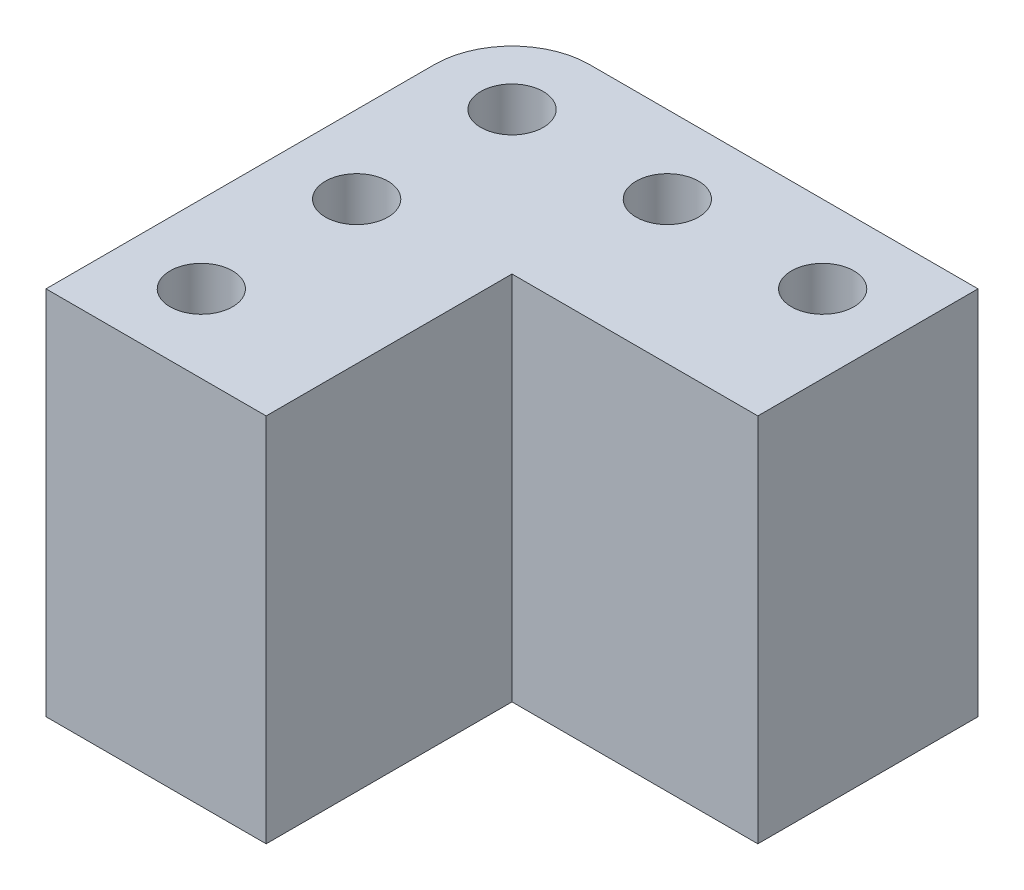
ISO-10303-21;
HEADER;
FILE_DESCRIPTION(('STEP AP214'),'2;1');
FILE_NAME('part.step','',(''),(''),'','','');
FILE_SCHEMA(('AUTOMOTIVE_DESIGN { 1 0 10303 214 1 1 1 1 }'));
ENDSEC;
DATA;
#1=APPLICATION_CONTEXT('core data for automotive mechanical design processes');
#2=APPLICATION_PROTOCOL_DEFINITION('international standard','automotive_design',2000,#1);
#3=PRODUCT_CONTEXT('',#1,'mechanical');
#4=PRODUCT('Part','Part','',(#3));
#5=PRODUCT_RELATED_PRODUCT_CATEGORY('part','',(#4));
#6=PRODUCT_DEFINITION_FORMATION('','',#4);
#7=PRODUCT_DEFINITION_CONTEXT('part definition',#1,'design');
#8=PRODUCT_DEFINITION('design','',#6,#7);
#9=PRODUCT_DEFINITION_SHAPE('','',#8);
#10=(LENGTH_UNIT() NAMED_UNIT(*) SI_UNIT(.MILLI.,.METRE.));
#11=(NAMED_UNIT(*) PLANE_ANGLE_UNIT() SI_UNIT($,.RADIAN.));
#12=(NAMED_UNIT(*) SI_UNIT($,.STERADIAN.) SOLID_ANGLE_UNIT());
#13=UNCERTAINTY_MEASURE_WITH_UNIT(LENGTH_MEASURE(1.E-05),#10,'distance_accuracy_value','');
#14=(GEOMETRIC_REPRESENTATION_CONTEXT(3) GLOBAL_UNCERTAINTY_ASSIGNED_CONTEXT((#13)) GLOBAL_UNIT_ASSIGNED_CONTEXT((#10,
#11,#12)) REPRESENTATION_CONTEXT('',''));
#15=CARTESIAN_POINT('',(0.,0.,0.));
#16=DIRECTION('',(0.,0.,1.));
#17=DIRECTION('',(1.,0.,0.));
#18=AXIS2_PLACEMENT_3D('',#15,#16,#17);
#19=CARTESIAN_POINT('',(0.,30.3,0.));
#20=DIRECTION('',(0.,1.,0.));
#21=DIRECTION('',(0.,0.,1.));
#22=AXIS2_PLACEMENT_3D('',#19,#20,#21);
#23=PLANE('',#22);
#24=CARTESIAN_POINT('',(6.35000000000002,30.3,6.35000000000001));
#25=DIRECTION('',(0.,1.,0.));
#26=DIRECTION('',(0.,0.,1.));
#27=AXIS2_PLACEMENT_3D('',#24,#25,#26);
#28=CIRCLE('',#27,2.55270000000002);
#29=CARTESIAN_POINT('',(6.35000000000002,30.3,8.90270000000003));
#30=VERTEX_POINT('',#29);
#31=EDGE_CURVE('E175',#30,#30,#28,.T.);
#32=ORIENTED_EDGE('',*,*,#31,.F.);
#33=EDGE_LOOP('',(#32));
#34=FACE_BOUND('',#33,.T.);
#35=CARTESIAN_POINT('',(19.05,30.3,6.35000000000001));
#36=DIRECTION('',(0.,1.,0.));
#37=DIRECTION('',(0.,0.,1.));
#38=AXIS2_PLACEMENT_3D('',#35,#36,#37);
#39=CIRCLE('',#38,2.55269999999999);
#40=CARTESIAN_POINT('',(19.05,30.3,8.9027));
#41=VERTEX_POINT('',#40);
#42=EDGE_CURVE('E172',#41,#41,#39,.T.);
#43=ORIENTED_EDGE('',*,*,#42,.F.);
#44=EDGE_LOOP('',(#43));
#45=FACE_BOUND('',#44,.T.);
#46=CARTESIAN_POINT('',(31.75,30.3,6.35000000000001));
#47=DIRECTION('',(0.,1.,0.));
#48=DIRECTION('',(0.,0.,1.));
#49=AXIS2_PLACEMENT_3D('',#46,#47,#48);
#50=CIRCLE('',#49,2.55269999999999);
#51=CARTESIAN_POINT('',(31.75,30.3,8.9027));
#52=VERTEX_POINT('',#51);
#53=EDGE_CURVE('E179',#52,#52,#50,.T.);
#54=ORIENTED_EDGE('',*,*,#53,.F.);
#55=EDGE_LOOP('',(#54));
#56=FACE_BOUND('',#55,.T.);
#57=CARTESIAN_POINT('',(6.35000000000002,30.3,19.05));
#58=DIRECTION('',(0.,1.,0.));
#59=DIRECTION('',(0.,0.,1.));
#60=AXIS2_PLACEMENT_3D('',#57,#58,#59);
#61=CIRCLE('',#60,2.55270000000002);
#62=CARTESIAN_POINT('',(6.35000000000002,30.3,21.6027));
#63=VERTEX_POINT('',#62);
#64=EDGE_CURVE('E185',#63,#63,#61,.T.);
#65=ORIENTED_EDGE('',*,*,#64,.F.);
#66=EDGE_LOOP('',(#65));
#67=FACE_BOUND('',#66,.T.);
#68=CARTESIAN_POINT('',(6.35000000000002,30.3,31.75));
#69=DIRECTION('',(0.,1.,0.));
#70=DIRECTION('',(0.,0.,1.));
#71=AXIS2_PLACEMENT_3D('',#68,#69,#70);
#72=CIRCLE('',#71,2.55270000000002);
#73=CARTESIAN_POINT('',(6.35000000000002,30.3,34.3027));
#74=VERTEX_POINT('',#73);
#75=EDGE_CURVE('E167',#74,#74,#72,.T.);
#76=ORIENTED_EDGE('',*,*,#75,.F.);
#77=EDGE_LOOP('',(#76));
#78=FACE_BOUND('',#77,.T.);
#79=CARTESIAN_POINT('',(6.35000000000002,30.3,6.35000000000002));
#80=DIRECTION('',(0.,-1.,0.));
#81=DIRECTION('',(0.,0.,1.));
#82=AXIS2_PLACEMENT_3D('',#79,#80,#81);
#83=CIRCLE('',#82,6.35000000000002);
#84=CARTESIAN_POINT('',(0.,30.3,6.35000000000001));
#85=VERTEX_POINT('',#84);
#86=CARTESIAN_POINT('',(6.35000000000002,30.3,0.));
#87=VERTEX_POINT('',#86);
#88=EDGE_CURVE('E154',#85,#87,#83,.T.);
#89=ORIENTED_EDGE('',*,*,#88,.F.);
#90=DIRECTION('',(0.,0.,1.));
#91=VECTOR('',#90,1.);
#92=CARTESIAN_POINT('',(0.,30.3,0.));
#93=LINE('',#92,#91);
#94=CARTESIAN_POINT('',(0.,30.3,38.1));
#95=VERTEX_POINT('',#94);
#96=EDGE_CURVE('E95',#85,#95,#93,.T.);
#97=ORIENTED_EDGE('',*,*,#96,.T.);
#98=DIRECTION('',(1.,0.,0.));
#99=VECTOR('',#98,1.);
#100=CARTESIAN_POINT('',(0.,30.3,38.1));
#101=LINE('',#100,#99);
#102=CARTESIAN_POINT('',(18.,30.3,38.1));
#103=VERTEX_POINT('',#102);
#104=EDGE_CURVE('E108',#95,#103,#101,.T.);
#105=ORIENTED_EDGE('',*,*,#104,.T.);
#106=DIRECTION('',(0.,0.,-1.));
#107=VECTOR('',#106,1.);
#108=CARTESIAN_POINT('',(18.,30.3,38.1));
#109=LINE('',#108,#107);
#110=CARTESIAN_POINT('',(18.,30.3,18.));
#111=VERTEX_POINT('',#110);
#112=EDGE_CURVE('E103',#103,#111,#109,.T.);
#113=ORIENTED_EDGE('',*,*,#112,.T.);
#114=DIRECTION('',(1.,0.,0.));
#115=VECTOR('',#114,1.);
#116=CARTESIAN_POINT('',(18.,30.3,18.));
#117=LINE('',#116,#115);
#118=CARTESIAN_POINT('',(38.1,30.3,18.));
#119=VERTEX_POINT('',#118);
#120=EDGE_CURVE('E106',#111,#119,#117,.T.);
#121=ORIENTED_EDGE('',*,*,#120,.T.);
#122=DIRECTION('',(0.,0.,-1.));
#123=VECTOR('',#122,1.);
#124=CARTESIAN_POINT('',(38.1,30.3,18.));
#125=LINE('',#124,#123);
#126=CARTESIAN_POINT('',(38.1,30.3,0.));
#127=VERTEX_POINT('',#126);
#128=EDGE_CURVE('E63',#119,#127,#125,.T.);
#129=ORIENTED_EDGE('',*,*,#128,.T.);
#130=DIRECTION('',(-1.,0.,0.));
#131=VECTOR('',#130,1.);
#132=CARTESIAN_POINT('',(0.,30.3,0.));
#133=LINE('',#132,#131);
#134=EDGE_CURVE('E124',#127,#87,#133,.T.);
#135=ORIENTED_EDGE('',*,*,#134,.T.);
#136=EDGE_LOOP('',(#89,#97,#105,#113,#121,#129,#135));
#137=FACE_BOUND('',#136,.T.);
#138=ADVANCED_FACE('F39',(#34,#45,#56,#67,#78,#137),#23,.T.);
#139=CARTESIAN_POINT('',(0.,0.,0.));
#140=DIRECTION('',(0.,1.,0.));
#141=DIRECTION('',(0.,0.,1.));
#142=AXIS2_PLACEMENT_3D('',#139,#140,#141);
#143=PLANE('',#142);
#144=CARTESIAN_POINT('',(6.35000000000002,0.,31.75));
#145=DIRECTION('',(0.,1.,0.));
#146=DIRECTION('',(0.,0.,1.));
#147=AXIS2_PLACEMENT_3D('',#144,#145,#146);
#148=CIRCLE('',#147,2.55270000000002);
#149=CARTESIAN_POINT('',(6.35000000000002,0.,34.3027));
#150=VERTEX_POINT('',#149);
#151=EDGE_CURVE('E164',#150,#150,#148,.T.);
#152=ORIENTED_EDGE('',*,*,#151,.T.);
#153=EDGE_LOOP('',(#152));
#154=FACE_BOUND('',#153,.T.);
#155=CARTESIAN_POINT('',(6.35000000000002,0.,19.05));
#156=DIRECTION('',(0.,1.,0.));
#157=DIRECTION('',(0.,0.,1.));
#158=AXIS2_PLACEMENT_3D('',#155,#156,#157);
#159=CIRCLE('',#158,2.55270000000002);
#160=CARTESIAN_POINT('',(6.35000000000002,0.,21.6027));
#161=VERTEX_POINT('',#160);
#162=EDGE_CURVE('E188',#161,#161,#159,.T.);
#163=ORIENTED_EDGE('',*,*,#162,.T.);
#164=EDGE_LOOP('',(#163));
#165=FACE_BOUND('',#164,.T.);
#166=CARTESIAN_POINT('',(31.75,0.,6.35000000000001));
#167=DIRECTION('',(0.,1.,0.));
#168=DIRECTION('',(0.,0.,1.));
#169=AXIS2_PLACEMENT_3D('',#166,#167,#168);
#170=CIRCLE('',#169,2.55269999999999);
#171=CARTESIAN_POINT('',(31.75,0.,8.9027));
#172=VERTEX_POINT('',#171);
#173=EDGE_CURVE('E182',#172,#172,#170,.T.);
#174=ORIENTED_EDGE('',*,*,#173,.T.);
#175=EDGE_LOOP('',(#174));
#176=FACE_BOUND('',#175,.T.);
#177=CARTESIAN_POINT('',(19.05,0.,6.35000000000001));
#178=DIRECTION('',(0.,1.,0.));
#179=DIRECTION('',(0.,0.,1.));
#180=AXIS2_PLACEMENT_3D('',#177,#178,#179);
#181=CIRCLE('',#180,2.55269999999999);
#182=CARTESIAN_POINT('',(19.05,0.,8.9027));
#183=VERTEX_POINT('',#182);
#184=EDGE_CURVE('E176',#183,#183,#181,.T.);
#185=ORIENTED_EDGE('',*,*,#184,.T.);
#186=EDGE_LOOP('',(#185));
#187=FACE_BOUND('',#186,.T.);
#188=CARTESIAN_POINT('',(6.35000000000002,0.,6.35000000000001));
#189=DIRECTION('',(0.,1.,0.));
#190=DIRECTION('',(0.,0.,1.));
#191=AXIS2_PLACEMENT_3D('',#188,#189,#190);
#192=CIRCLE('',#191,2.55270000000002);
#193=CARTESIAN_POINT('',(6.35000000000002,0.,8.90270000000003));
#194=VERTEX_POINT('',#193);
#195=EDGE_CURVE('E133',#194,#194,#192,.T.);
#196=ORIENTED_EDGE('',*,*,#195,.T.);
#197=EDGE_LOOP('',(#196));
#198=FACE_BOUND('',#197,.T.);
#199=DIRECTION('',(0.,0.,1.));
#200=VECTOR('',#199,1.);
#201=CARTESIAN_POINT('',(0.,0.,0.));
#202=LINE('',#201,#200);
#203=CARTESIAN_POINT('',(0.,0.,6.35000000000001));
#204=VERTEX_POINT('',#203);
#205=CARTESIAN_POINT('',(0.,0.,38.1));
#206=VERTEX_POINT('',#205);
#207=EDGE_CURVE('E130',#204,#206,#202,.T.);
#208=ORIENTED_EDGE('',*,*,#207,.F.);
#209=CARTESIAN_POINT('',(6.35000000000002,0.,6.35000000000002));
#210=DIRECTION('',(0.,-1.,0.));
#211=DIRECTION('',(0.,0.,1.));
#212=AXIS2_PLACEMENT_3D('',#209,#210,#211);
#213=CIRCLE('',#212,6.35000000000002);
#214=CARTESIAN_POINT('',(6.35000000000002,0.,0.));
#215=VERTEX_POINT('',#214);
#216=EDGE_CURVE('E157',#204,#215,#213,.T.);
#217=ORIENTED_EDGE('',*,*,#216,.T.);
#218=DIRECTION('',(-1.,0.,0.));
#219=VECTOR('',#218,1.);
#220=CARTESIAN_POINT('',(0.,0.,0.));
#221=LINE('',#220,#219);
#222=CARTESIAN_POINT('',(38.1,0.,0.));
#223=VERTEX_POINT('',#222);
#224=EDGE_CURVE('E139',#223,#215,#221,.T.);
#225=ORIENTED_EDGE('',*,*,#224,.F.);
#226=DIRECTION('',(0.,0.,-1.));
#227=VECTOR('',#226,1.);
#228=CARTESIAN_POINT('',(38.1,0.,18.));
#229=LINE('',#228,#227);
#230=CARTESIAN_POINT('',(38.1,0.,18.));
#231=VERTEX_POINT('',#230);
#232=EDGE_CURVE('E87',#231,#223,#229,.T.);
#233=ORIENTED_EDGE('',*,*,#232,.F.);
#234=DIRECTION('',(1.,0.,0.));
#235=VECTOR('',#234,1.);
#236=CARTESIAN_POINT('',(18.,0.,18.));
#237=LINE('',#236,#235);
#238=CARTESIAN_POINT('',(18.,0.,18.));
#239=VERTEX_POINT('',#238);
#240=EDGE_CURVE('E136',#239,#231,#237,.T.);
#241=ORIENTED_EDGE('',*,*,#240,.F.);
#242=DIRECTION('',(0.,0.,-1.));
#243=VECTOR('',#242,1.);
#244=CARTESIAN_POINT('',(18.,0.,38.1));
#245=LINE('',#244,#243);
#246=CARTESIAN_POINT('',(18.,0.,38.1));
#247=VERTEX_POINT('',#246);
#248=EDGE_CURVE('E117',#247,#239,#245,.T.);
#249=ORIENTED_EDGE('',*,*,#248,.F.);
#250=DIRECTION('',(1.,0.,0.));
#251=VECTOR('',#250,1.);
#252=CARTESIAN_POINT('',(0.,0.,38.1));
#253=LINE('',#252,#251);
#254=EDGE_CURVE('E132',#206,#247,#253,.T.);
#255=ORIENTED_EDGE('',*,*,#254,.F.);
#256=EDGE_LOOP('',(#208,#217,#225,#233,#241,#249,#255));
#257=FACE_BOUND('',#256,.T.);
#258=ADVANCED_FACE('F147',(#154,#165,#176,#187,#198,#257),#143,.F.);
#259=CARTESIAN_POINT('',(0.,30.3,0.));
#260=DIRECTION('',(1.,0.,0.));
#261=DIRECTION('',(0.,0.,-1.));
#262=AXIS2_PLACEMENT_3D('',#259,#260,#261);
#263=PLANE('',#262);
#264=ORIENTED_EDGE('',*,*,#96,.F.);
#265=DIRECTION('',(0.,1.,0.));
#266=VECTOR('',#265,1.);
#267=CARTESIAN_POINT('',(0.,0.,6.35000000000001));
#268=LINE('',#267,#266);
#269=EDGE_CURVE('E160',#204,#85,#268,.T.);
#270=ORIENTED_EDGE('',*,*,#269,.F.);
#271=ORIENTED_EDGE('',*,*,#207,.T.);
#272=DIRECTION('',(0.,-1.,0.));
#273=VECTOR('',#272,1.);
#274=CARTESIAN_POINT('',(0.,30.3,38.1));
#275=LINE('',#274,#273);
#276=EDGE_CURVE('E11',#95,#206,#275,.T.);
#277=ORIENTED_EDGE('',*,*,#276,.F.);
#278=EDGE_LOOP('',(#264,#270,#271,#277));
#279=FACE_BOUND('',#278,.T.);
#280=ADVANCED_FACE('F41',(#279),#263,.F.);
#281=CARTESIAN_POINT('',(0.,30.3,38.1));
#282=DIRECTION('',(0.,0.,-1.));
#283=DIRECTION('',(-1.,0.,0.));
#284=AXIS2_PLACEMENT_3D('',#281,#282,#283);
#285=PLANE('',#284);
#286=ORIENTED_EDGE('',*,*,#254,.T.);
#287=DIRECTION('',(0.,-1.,0.));
#288=VECTOR('',#287,1.);
#289=CARTESIAN_POINT('',(18.,30.3,38.1));
#290=LINE('',#289,#288);
#291=EDGE_CURVE('E47',#103,#247,#290,.T.);
#292=ORIENTED_EDGE('',*,*,#291,.F.);
#293=ORIENTED_EDGE('',*,*,#104,.F.);
#294=ORIENTED_EDGE('',*,*,#276,.T.);
#295=EDGE_LOOP('',(#286,#292,#293,#294));
#296=FACE_BOUND('',#295,.T.);
#297=ADVANCED_FACE('F242',(#296),#285,.F.);
#298=CARTESIAN_POINT('',(18.,30.3,38.1));
#299=DIRECTION('',(-1.,0.,0.));
#300=DIRECTION('',(0.,0.,1.));
#301=AXIS2_PLACEMENT_3D('',#298,#299,#300);
#302=PLANE('',#301);
#303=ORIENTED_EDGE('',*,*,#248,.T.);
#304=DIRECTION('',(0.,-1.,0.));
#305=VECTOR('',#304,1.);
#306=CARTESIAN_POINT('',(18.,30.3,18.));
#307=LINE('',#306,#305);
#308=EDGE_CURVE('E114',#111,#239,#307,.T.);
#309=ORIENTED_EDGE('',*,*,#308,.F.);
#310=ORIENTED_EDGE('',*,*,#112,.F.);
#311=ORIENTED_EDGE('',*,*,#291,.T.);
#312=EDGE_LOOP('',(#303,#309,#310,#311));
#313=FACE_BOUND('',#312,.T.);
#314=ADVANCED_FACE('F115',(#313),#302,.F.);
#315=CARTESIAN_POINT('',(18.,30.3,18.));
#316=DIRECTION('',(0.,0.,-1.));
#317=DIRECTION('',(-1.,0.,0.));
#318=AXIS2_PLACEMENT_3D('',#315,#316,#317);
#319=PLANE('',#318);
#320=ORIENTED_EDGE('',*,*,#240,.T.);
#321=DIRECTION('',(0.,-1.,0.));
#322=VECTOR('',#321,1.);
#323=CARTESIAN_POINT('',(38.1,30.3,18.));
#324=LINE('',#323,#322);
#325=EDGE_CURVE('E120',#119,#231,#324,.T.);
#326=ORIENTED_EDGE('',*,*,#325,.F.);
#327=ORIENTED_EDGE('',*,*,#120,.F.);
#328=ORIENTED_EDGE('',*,*,#308,.T.);
#329=EDGE_LOOP('',(#320,#326,#327,#328));
#330=FACE_BOUND('',#329,.T.);
#331=ADVANCED_FACE('F122',(#330),#319,.F.);
#332=CARTESIAN_POINT('',(38.1,30.3,18.));
#333=DIRECTION('',(-1.,0.,0.));
#334=DIRECTION('',(0.,0.,1.));
#335=AXIS2_PLACEMENT_3D('',#332,#333,#334);
#336=PLANE('',#335);
#337=ORIENTED_EDGE('',*,*,#232,.T.);
#338=DIRECTION('',(0.,-1.,0.));
#339=VECTOR('',#338,1.);
#340=CARTESIAN_POINT('',(38.1,30.3,0.));
#341=LINE('',#340,#339);
#342=EDGE_CURVE('E129',#127,#223,#341,.T.);
#343=ORIENTED_EDGE('',*,*,#342,.F.);
#344=ORIENTED_EDGE('',*,*,#128,.F.);
#345=ORIENTED_EDGE('',*,*,#325,.T.);
#346=EDGE_LOOP('',(#337,#343,#344,#345));
#347=FACE_BOUND('',#346,.T.);
#348=ADVANCED_FACE('F149',(#347),#336,.F.);
#349=CARTESIAN_POINT('',(0.,30.3,0.));
#350=DIRECTION('',(0.,0.,1.));
#351=DIRECTION('',(1.,0.,0.));
#352=AXIS2_PLACEMENT_3D('',#349,#350,#351);
#353=PLANE('',#352);
#354=ORIENTED_EDGE('',*,*,#224,.T.);
#355=DIRECTION('',(0.,1.,0.));
#356=VECTOR('',#355,1.);
#357=CARTESIAN_POINT('',(6.35000000000002,0.,0.));
#358=LINE('',#357,#356);
#359=EDGE_CURVE('E54',#215,#87,#358,.T.);
#360=ORIENTED_EDGE('',*,*,#359,.T.);
#361=ORIENTED_EDGE('',*,*,#134,.F.);
#362=ORIENTED_EDGE('',*,*,#342,.T.);
#363=EDGE_LOOP('',(#354,#360,#361,#362));
#364=FACE_BOUND('',#363,.T.);
#365=ADVANCED_FACE('F152',(#364),#353,.F.);
#366=CARTESIAN_POINT('',(6.35000000000002,0.,6.35000000000001));
#367=DIRECTION('',(0.,1.,0.));
#368=DIRECTION('',(0.,0.,1.));
#369=AXIS2_PLACEMENT_3D('',#366,#367,#368);
#370=CYLINDRICAL_SURFACE('',#369,2.55270000000002);
#371=CARTESIAN_POINT('',(6.35000000000002,0.,8.90270000000003));
#372=CARTESIAN_POINT('',(6.35000000000002,0.315625,8.90270000000003));
#373=CARTESIAN_POINT('',(6.35000000000002,0.63125,8.90270000000003));
#374=CARTESIAN_POINT('',(6.35000000000002,1.2625,8.90270000000003));
#375=CARTESIAN_POINT('',(6.35000000000002,1.578125,8.90270000000003));
#376=CARTESIAN_POINT('',(6.35000000000002,2.209375,8.90270000000003));
#377=CARTESIAN_POINT('',(6.35000000000002,2.525,8.90270000000003));
#378=CARTESIAN_POINT('',(6.35000000000002,3.15625,8.90270000000003));
#379=CARTESIAN_POINT('',(6.35000000000002,3.471875,8.90270000000003));
#380=CARTESIAN_POINT('',(6.35000000000002,4.103125,8.90270000000003));
#381=CARTESIAN_POINT('',(6.35000000000002,4.41875,8.90270000000003));
#382=CARTESIAN_POINT('',(6.35000000000002,5.05,8.90270000000003));
#383=CARTESIAN_POINT('',(6.35000000000002,5.365625,8.90270000000003));
#384=CARTESIAN_POINT('',(6.35000000000002,5.996875,8.90270000000003));
#385=CARTESIAN_POINT('',(6.35000000000002,6.3125,8.90270000000003));
#386=CARTESIAN_POINT('',(6.35000000000002,6.94375,8.90270000000003));
#387=CARTESIAN_POINT('',(6.35000000000002,7.259375,8.90270000000003));
#388=CARTESIAN_POINT('',(6.35000000000002,7.890625,8.90270000000003));
#389=CARTESIAN_POINT('',(6.35000000000002,8.20625,8.90270000000003));
#390=CARTESIAN_POINT('',(6.35000000000002,8.8375,8.90270000000003));
#391=CARTESIAN_POINT('',(6.35000000000002,9.153125,8.90270000000003));
#392=CARTESIAN_POINT('',(6.35000000000002,9.784375,8.90270000000003));
#393=CARTESIAN_POINT('',(6.35000000000002,10.1,8.90270000000003));
#394=CARTESIAN_POINT('',(6.35000000000002,10.73125,8.90270000000003));
#395=CARTESIAN_POINT('',(6.35000000000002,11.046875,8.90270000000003));
#396=CARTESIAN_POINT('',(6.35000000000002,11.678125,8.90270000000003));
#397=CARTESIAN_POINT('',(6.35000000000002,11.99375,8.90270000000003));
#398=CARTESIAN_POINT('',(6.35000000000002,12.625,8.90270000000003));
#399=CARTESIAN_POINT('',(6.35000000000002,12.940625,8.90270000000003));
#400=CARTESIAN_POINT('',(6.35000000000002,13.571875,8.90270000000003));
#401=CARTESIAN_POINT('',(6.35000000000002,13.8875,8.90270000000003));
#402=CARTESIAN_POINT('',(6.35000000000002,14.51875,8.90270000000003));
#403=CARTESIAN_POINT('',(6.35000000000002,14.834375,8.90270000000003));
#404=CARTESIAN_POINT('',(6.35000000000002,15.465625,8.90270000000003));
#405=CARTESIAN_POINT('',(6.35000000000002,15.78125,8.90270000000003));
#406=CARTESIAN_POINT('',(6.35000000000002,16.4125,8.90270000000003));
#407=CARTESIAN_POINT('',(6.35000000000002,16.728125,8.90270000000003));
#408=CARTESIAN_POINT('',(6.35000000000002,17.359375,8.90270000000003));
#409=CARTESIAN_POINT('',(6.35000000000002,17.675,8.90270000000003));
#410=CARTESIAN_POINT('',(6.35000000000002,18.30625,8.90270000000003));
#411=CARTESIAN_POINT('',(6.35000000000002,18.621875,8.90270000000003));
#412=CARTESIAN_POINT('',(6.35000000000002,19.253125,8.90270000000003));
#413=CARTESIAN_POINT('',(6.35000000000002,19.56875,8.90270000000003));
#414=CARTESIAN_POINT('',(6.35000000000002,20.2,8.90270000000003));
#415=CARTESIAN_POINT('',(6.35000000000002,20.515625,8.90270000000003));
#416=CARTESIAN_POINT('',(6.35000000000002,21.146875,8.90270000000003));
#417=CARTESIAN_POINT('',(6.35000000000002,21.4625,8.90270000000003));
#418=CARTESIAN_POINT('',(6.35000000000002,22.09375,8.90270000000003));
#419=CARTESIAN_POINT('',(6.35000000000002,22.409375,8.90270000000003));
#420=CARTESIAN_POINT('',(6.35000000000002,23.040625,8.90270000000003));
#421=CARTESIAN_POINT('',(6.35000000000002,23.35625,8.90270000000003));
#422=CARTESIAN_POINT('',(6.35000000000002,23.9875,8.90270000000003));
#423=CARTESIAN_POINT('',(6.35000000000002,24.303125,8.90270000000003));
#424=CARTESIAN_POINT('',(6.35000000000002,24.934375,8.90270000000003));
#425=CARTESIAN_POINT('',(6.35000000000002,25.25,8.90270000000003));
#426=CARTESIAN_POINT('',(6.35000000000002,25.88125,8.90270000000003));
#427=CARTESIAN_POINT('',(6.35000000000002,26.196875,8.90270000000003));
#428=CARTESIAN_POINT('',(6.35000000000002,26.828125,8.90270000000003));
#429=CARTESIAN_POINT('',(6.35000000000002,27.14375,8.90270000000003));
#430=CARTESIAN_POINT('',(6.35000000000002,27.775,8.90270000000003));
#431=CARTESIAN_POINT('',(6.35000000000002,28.090625,8.90270000000003));
#432=CARTESIAN_POINT('',(6.35000000000002,28.721875,8.90270000000003));
#433=CARTESIAN_POINT('',(6.35000000000002,29.0375,8.90270000000003));
#434=CARTESIAN_POINT('',(6.35000000000002,29.66875,8.90270000000003));
#435=CARTESIAN_POINT('',(6.35000000000002,29.984375,8.90270000000003));
#436=CARTESIAN_POINT('',(6.35000000000002,30.3,8.90270000000003));
#437=B_SPLINE_CURVE_WITH_KNOTS('',3,(#371,#372,#373,#374,#375,#376,#377,#378,#379,#380,#381,
#382,#383,#384,#385,#386,#387,#388,#389,#390,#391,#392,#393,#394,#395,#396,#397,#398,#399,#400,
#401,#402,#403,#404,#405,#406,#407,#408,#409,#410,#411,#412,#413,#414,#415,#416,#417,#418,#419,
#420,#421,#422,#423,#424,#425,#426,#427,#428,#429,#430,#431,#432,#433,#434,#435,#436),
.UNSPECIFIED.,.F.,.F.,(4,2,2,2,2,2,2,2,2,2,2,2,2,2,2,2,2,2,2,2,2,2,2,2,2,2,2,2,2,2,2,2,4),(0.,
0.946875,1.89375,2.840625,3.7875,4.734375,5.68125,6.628125,7.575,8.521875,9.46875,10.415625,
11.3625,12.309375,13.25625,14.203125,15.15,16.096875,17.04375,17.990625,18.9375,19.884375,
20.83125,21.778125,22.725,23.671875,24.61875,25.565625,26.5125,27.459375,28.40625,29.353125,
30.3),.UNSPECIFIED.);
#438=EDGE_CURVE('BSEAM199',#194,#30,#437,.T.);
#439=ORIENTED_EDGE('',*,*,#195,.F.);
#440=ORIENTED_EDGE('',*,*,#31,.T.);
#441=ORIENTED_EDGE('',*,*,#438,.T.);
#442=ORIENTED_EDGE('',*,*,#438,.F.);
#443=EDGE_LOOP('',(#439,#441,#440,#442));
#444=FACE_BOUND('',#443,.T.);
#445=ADVANCED_FACE('F199',(#444),#370,.F.);
#446=CARTESIAN_POINT('',(19.05,0.,6.35000000000001));
#447=DIRECTION('',(0.,1.,0.));
#448=DIRECTION('',(0.,0.,1.));
#449=AXIS2_PLACEMENT_3D('',#446,#447,#448);
#450=CYLINDRICAL_SURFACE('',#449,2.55269999999999);
#451=CARTESIAN_POINT('',(19.05,0.,8.9027));
#452=CARTESIAN_POINT('',(19.05,0.315625,8.9027));
#453=CARTESIAN_POINT('',(19.05,0.63125,8.9027));
#454=CARTESIAN_POINT('',(19.05,1.2625,8.9027));
#455=CARTESIAN_POINT('',(19.05,1.578125,8.9027));
#456=CARTESIAN_POINT('',(19.05,2.209375,8.9027));
#457=CARTESIAN_POINT('',(19.05,2.525,8.9027));
#458=CARTESIAN_POINT('',(19.05,3.15625,8.9027));
#459=CARTESIAN_POINT('',(19.05,3.471875,8.9027));
#460=CARTESIAN_POINT('',(19.05,4.103125,8.9027));
#461=CARTESIAN_POINT('',(19.05,4.41875,8.9027));
#462=CARTESIAN_POINT('',(19.05,5.05,8.9027));
#463=CARTESIAN_POINT('',(19.05,5.365625,8.9027));
#464=CARTESIAN_POINT('',(19.05,5.996875,8.9027));
#465=CARTESIAN_POINT('',(19.05,6.3125,8.9027));
#466=CARTESIAN_POINT('',(19.05,6.94375,8.9027));
#467=CARTESIAN_POINT('',(19.05,7.259375,8.9027));
#468=CARTESIAN_POINT('',(19.05,7.890625,8.9027));
#469=CARTESIAN_POINT('',(19.05,8.20625,8.9027));
#470=CARTESIAN_POINT('',(19.05,8.8375,8.9027));
#471=CARTESIAN_POINT('',(19.05,9.153125,8.9027));
#472=CARTESIAN_POINT('',(19.05,9.784375,8.9027));
#473=CARTESIAN_POINT('',(19.05,10.1,8.9027));
#474=CARTESIAN_POINT('',(19.05,10.73125,8.9027));
#475=CARTESIAN_POINT('',(19.05,11.046875,8.9027));
#476=CARTESIAN_POINT('',(19.05,11.678125,8.9027));
#477=CARTESIAN_POINT('',(19.05,11.99375,8.9027));
#478=CARTESIAN_POINT('',(19.05,12.625,8.9027));
#479=CARTESIAN_POINT('',(19.05,12.940625,8.9027));
#480=CARTESIAN_POINT('',(19.05,13.571875,8.9027));
#481=CARTESIAN_POINT('',(19.05,13.8875,8.9027));
#482=CARTESIAN_POINT('',(19.05,14.51875,8.9027));
#483=CARTESIAN_POINT('',(19.05,14.834375,8.9027));
#484=CARTESIAN_POINT('',(19.05,15.465625,8.9027));
#485=CARTESIAN_POINT('',(19.05,15.78125,8.9027));
#486=CARTESIAN_POINT('',(19.05,16.4125,8.9027));
#487=CARTESIAN_POINT('',(19.05,16.728125,8.9027));
#488=CARTESIAN_POINT('',(19.05,17.359375,8.9027));
#489=CARTESIAN_POINT('',(19.05,17.675,8.9027));
#490=CARTESIAN_POINT('',(19.05,18.30625,8.9027));
#491=CARTESIAN_POINT('',(19.05,18.621875,8.9027));
#492=CARTESIAN_POINT('',(19.05,19.253125,8.9027));
#493=CARTESIAN_POINT('',(19.05,19.56875,8.9027));
#494=CARTESIAN_POINT('',(19.05,20.2,8.9027));
#495=CARTESIAN_POINT('',(19.05,20.515625,8.9027));
#496=CARTESIAN_POINT('',(19.05,21.146875,8.9027));
#497=CARTESIAN_POINT('',(19.05,21.4625,8.9027));
#498=CARTESIAN_POINT('',(19.05,22.09375,8.9027));
#499=CARTESIAN_POINT('',(19.05,22.409375,8.9027));
#500=CARTESIAN_POINT('',(19.05,23.040625,8.9027));
#501=CARTESIAN_POINT('',(19.05,23.35625,8.9027));
#502=CARTESIAN_POINT('',(19.05,23.9875,8.9027));
#503=CARTESIAN_POINT('',(19.05,24.303125,8.9027));
#504=CARTESIAN_POINT('',(19.05,24.934375,8.9027));
#505=CARTESIAN_POINT('',(19.05,25.25,8.9027));
#506=CARTESIAN_POINT('',(19.05,25.88125,8.9027));
#507=CARTESIAN_POINT('',(19.05,26.196875,8.9027));
#508=CARTESIAN_POINT('',(19.05,26.828125,8.9027));
#509=CARTESIAN_POINT('',(19.05,27.14375,8.9027));
#510=CARTESIAN_POINT('',(19.05,27.775,8.9027));
#511=CARTESIAN_POINT('',(19.05,28.090625,8.9027));
#512=CARTESIAN_POINT('',(19.05,28.721875,8.9027));
#513=CARTESIAN_POINT('',(19.05,29.0375,8.9027));
#514=CARTESIAN_POINT('',(19.05,29.66875,8.9027));
#515=CARTESIAN_POINT('',(19.05,29.984375,8.9027));
#516=CARTESIAN_POINT('',(19.05,30.3,8.9027));
#517=B_SPLINE_CURVE_WITH_KNOTS('',3,(#451,#452,#453,#454,#455,#456,#457,#458,#459,#460,#461,
#462,#463,#464,#465,#466,#467,#468,#469,#470,#471,#472,#473,#474,#475,#476,#477,#478,#479,#480,
#481,#482,#483,#484,#485,#486,#487,#488,#489,#490,#491,#492,#493,#494,#495,#496,#497,#498,#499,
#500,#501,#502,#503,#504,#505,#506,#507,#508,#509,#510,#511,#512,#513,#514,#515,#516),
.UNSPECIFIED.,.F.,.F.,(4,2,2,2,2,2,2,2,2,2,2,2,2,2,2,2,2,2,2,2,2,2,2,2,2,2,2,2,2,2,2,2,4),(0.,
0.946875,1.89375,2.840625,3.7875,4.734375,5.68125,6.628125,7.575,8.521875,9.46875,10.415625,
11.3625,12.309375,13.25625,14.203125,15.15,16.096875,17.04375,17.990625,18.9375,19.884375,
20.83125,21.778125,22.725,23.671875,24.61875,25.565625,26.5125,27.459375,28.40625,29.353125,
30.3),.UNSPECIFIED.);
#518=EDGE_CURVE('BSEAM229',#183,#41,#517,.T.);
#519=ORIENTED_EDGE('',*,*,#184,.F.);
#520=ORIENTED_EDGE('',*,*,#42,.T.);
#521=ORIENTED_EDGE('',*,*,#518,.T.);
#522=ORIENTED_EDGE('',*,*,#518,.F.);
#523=EDGE_LOOP('',(#519,#521,#520,#522));
#524=FACE_BOUND('',#523,.T.);
#525=ADVANCED_FACE('F229',(#524),#450,.F.);
#526=CARTESIAN_POINT('',(31.75,0.,6.35000000000001));
#527=DIRECTION('',(0.,1.,0.));
#528=DIRECTION('',(0.,0.,1.));
#529=AXIS2_PLACEMENT_3D('',#526,#527,#528);
#530=CYLINDRICAL_SURFACE('',#529,2.55269999999999);
#531=CARTESIAN_POINT('',(31.75,0.,8.9027));
#532=CARTESIAN_POINT('',(31.75,0.315625,8.9027));
#533=CARTESIAN_POINT('',(31.75,0.63125,8.9027));
#534=CARTESIAN_POINT('',(31.75,1.2625,8.9027));
#535=CARTESIAN_POINT('',(31.75,1.578125,8.9027));
#536=CARTESIAN_POINT('',(31.75,2.209375,8.9027));
#537=CARTESIAN_POINT('',(31.75,2.525,8.9027));
#538=CARTESIAN_POINT('',(31.75,3.15625,8.9027));
#539=CARTESIAN_POINT('',(31.75,3.471875,8.9027));
#540=CARTESIAN_POINT('',(31.75,4.103125,8.9027));
#541=CARTESIAN_POINT('',(31.75,4.41875,8.9027));
#542=CARTESIAN_POINT('',(31.75,5.05,8.9027));
#543=CARTESIAN_POINT('',(31.75,5.365625,8.9027));
#544=CARTESIAN_POINT('',(31.75,5.996875,8.9027));
#545=CARTESIAN_POINT('',(31.75,6.3125,8.9027));
#546=CARTESIAN_POINT('',(31.75,6.94375,8.9027));
#547=CARTESIAN_POINT('',(31.75,7.259375,8.9027));
#548=CARTESIAN_POINT('',(31.75,7.890625,8.9027));
#549=CARTESIAN_POINT('',(31.75,8.20625,8.9027));
#550=CARTESIAN_POINT('',(31.75,8.8375,8.9027));
#551=CARTESIAN_POINT('',(31.75,9.153125,8.9027));
#552=CARTESIAN_POINT('',(31.75,9.784375,8.9027));
#553=CARTESIAN_POINT('',(31.75,10.1,8.9027));
#554=CARTESIAN_POINT('',(31.75,10.73125,8.9027));
#555=CARTESIAN_POINT('',(31.75,11.046875,8.9027));
#556=CARTESIAN_POINT('',(31.75,11.678125,8.9027));
#557=CARTESIAN_POINT('',(31.75,11.99375,8.9027));
#558=CARTESIAN_POINT('',(31.75,12.625,8.9027));
#559=CARTESIAN_POINT('',(31.75,12.940625,8.9027));
#560=CARTESIAN_POINT('',(31.75,13.571875,8.9027));
#561=CARTESIAN_POINT('',(31.75,13.8875,8.9027));
#562=CARTESIAN_POINT('',(31.75,14.51875,8.9027));
#563=CARTESIAN_POINT('',(31.75,14.834375,8.9027));
#564=CARTESIAN_POINT('',(31.75,15.465625,8.9027));
#565=CARTESIAN_POINT('',(31.75,15.78125,8.9027));
#566=CARTESIAN_POINT('',(31.75,16.4125,8.9027));
#567=CARTESIAN_POINT('',(31.75,16.728125,8.9027));
#568=CARTESIAN_POINT('',(31.75,17.359375,8.9027));
#569=CARTESIAN_POINT('',(31.75,17.675,8.9027));
#570=CARTESIAN_POINT('',(31.75,18.30625,8.9027));
#571=CARTESIAN_POINT('',(31.75,18.621875,8.9027));
#572=CARTESIAN_POINT('',(31.75,19.253125,8.9027));
#573=CARTESIAN_POINT('',(31.75,19.56875,8.9027));
#574=CARTESIAN_POINT('',(31.75,20.2,8.9027));
#575=CARTESIAN_POINT('',(31.75,20.515625,8.9027));
#576=CARTESIAN_POINT('',(31.75,21.146875,8.9027));
#577=CARTESIAN_POINT('',(31.75,21.4625,8.9027));
#578=CARTESIAN_POINT('',(31.75,22.09375,8.9027));
#579=CARTESIAN_POINT('',(31.75,22.409375,8.9027));
#580=CARTESIAN_POINT('',(31.75,23.040625,8.9027));
#581=CARTESIAN_POINT('',(31.75,23.35625,8.9027));
#582=CARTESIAN_POINT('',(31.75,23.9875,8.9027));
#583=CARTESIAN_POINT('',(31.75,24.303125,8.9027));
#584=CARTESIAN_POINT('',(31.75,24.934375,8.9027));
#585=CARTESIAN_POINT('',(31.75,25.25,8.9027));
#586=CARTESIAN_POINT('',(31.75,25.88125,8.9027));
#587=CARTESIAN_POINT('',(31.75,26.196875,8.9027));
#588=CARTESIAN_POINT('',(31.75,26.828125,8.9027));
#589=CARTESIAN_POINT('',(31.75,27.14375,8.9027));
#590=CARTESIAN_POINT('',(31.75,27.775,8.9027));
#591=CARTESIAN_POINT('',(31.75,28.090625,8.9027));
#592=CARTESIAN_POINT('',(31.75,28.721875,8.9027));
#593=CARTESIAN_POINT('',(31.75,29.0375,8.9027));
#594=CARTESIAN_POINT('',(31.75,29.66875,8.9027));
#595=CARTESIAN_POINT('',(31.75,29.984375,8.9027));
#596=CARTESIAN_POINT('',(31.75,30.3,8.9027));
#597=B_SPLINE_CURVE_WITH_KNOTS('',3,(#531,#532,#533,#534,#535,#536,#537,#538,#539,#540,#541,
#542,#543,#544,#545,#546,#547,#548,#549,#550,#551,#552,#553,#554,#555,#556,#557,#558,#559,#560,
#561,#562,#563,#564,#565,#566,#567,#568,#569,#570,#571,#572,#573,#574,#575,#576,#577,#578,#579,
#580,#581,#582,#583,#584,#585,#586,#587,#588,#589,#590,#591,#592,#593,#594,#595,#596),
.UNSPECIFIED.,.F.,.F.,(4,2,2,2,2,2,2,2,2,2,2,2,2,2,2,2,2,2,2,2,2,2,2,2,2,2,2,2,2,2,2,2,4),(0.,
0.946875,1.89375,2.840625,3.7875,4.734375,5.68125,6.628125,7.575,8.521875,9.46875,10.415625,
11.3625,12.309375,13.25625,14.203125,15.15,16.096875,17.04375,17.990625,18.9375,19.884375,
20.83125,21.778125,22.725,23.671875,24.61875,25.565625,26.5125,27.459375,28.40625,29.353125,
30.3),.UNSPECIFIED.);
#598=EDGE_CURVE('BSEAM222',#172,#52,#597,.T.);
#599=ORIENTED_EDGE('',*,*,#173,.F.);
#600=ORIENTED_EDGE('',*,*,#53,.T.);
#601=ORIENTED_EDGE('',*,*,#598,.T.);
#602=ORIENTED_EDGE('',*,*,#598,.F.);
#603=EDGE_LOOP('',(#599,#601,#600,#602));
#604=FACE_BOUND('',#603,.T.);
#605=ADVANCED_FACE('F222',(#604),#530,.F.);
#606=CARTESIAN_POINT('',(6.35000000000002,0.,19.05));
#607=DIRECTION('',(0.,1.,0.));
#608=DIRECTION('',(0.,0.,1.));
#609=AXIS2_PLACEMENT_3D('',#606,#607,#608);
#610=CYLINDRICAL_SURFACE('',#609,2.55270000000002);
#611=CARTESIAN_POINT('',(6.35000000000002,0.,21.6027));
#612=CARTESIAN_POINT('',(6.35000000000002,0.315625,21.6027));
#613=CARTESIAN_POINT('',(6.35000000000002,0.63125,21.6027));
#614=CARTESIAN_POINT('',(6.35000000000002,1.2625,21.6027));
#615=CARTESIAN_POINT('',(6.35000000000002,1.578125,21.6027));
#616=CARTESIAN_POINT('',(6.35000000000002,2.209375,21.6027));
#617=CARTESIAN_POINT('',(6.35000000000002,2.525,21.6027));
#618=CARTESIAN_POINT('',(6.35000000000002,3.15625,21.6027));
#619=CARTESIAN_POINT('',(6.35000000000002,3.471875,21.6027));
#620=CARTESIAN_POINT('',(6.35000000000002,4.103125,21.6027));
#621=CARTESIAN_POINT('',(6.35000000000002,4.41875,21.6027));
#622=CARTESIAN_POINT('',(6.35000000000002,5.05,21.6027));
#623=CARTESIAN_POINT('',(6.35000000000002,5.365625,21.6027));
#624=CARTESIAN_POINT('',(6.35000000000002,5.996875,21.6027));
#625=CARTESIAN_POINT('',(6.35000000000002,6.3125,21.6027));
#626=CARTESIAN_POINT('',(6.35000000000002,6.94375,21.6027));
#627=CARTESIAN_POINT('',(6.35000000000002,7.259375,21.6027));
#628=CARTESIAN_POINT('',(6.35000000000002,7.890625,21.6027));
#629=CARTESIAN_POINT('',(6.35000000000002,8.20625,21.6027));
#630=CARTESIAN_POINT('',(6.35000000000002,8.8375,21.6027));
#631=CARTESIAN_POINT('',(6.35000000000002,9.153125,21.6027));
#632=CARTESIAN_POINT('',(6.35000000000002,9.784375,21.6027));
#633=CARTESIAN_POINT('',(6.35000000000002,10.1,21.6027));
#634=CARTESIAN_POINT('',(6.35000000000002,10.73125,21.6027));
#635=CARTESIAN_POINT('',(6.35000000000002,11.046875,21.6027));
#636=CARTESIAN_POINT('',(6.35000000000002,11.678125,21.6027));
#637=CARTESIAN_POINT('',(6.35000000000002,11.99375,21.6027));
#638=CARTESIAN_POINT('',(6.35000000000002,12.625,21.6027));
#639=CARTESIAN_POINT('',(6.35000000000002,12.940625,21.6027));
#640=CARTESIAN_POINT('',(6.35000000000002,13.571875,21.6027));
#641=CARTESIAN_POINT('',(6.35000000000002,13.8875,21.6027));
#642=CARTESIAN_POINT('',(6.35000000000002,14.51875,21.6027));
#643=CARTESIAN_POINT('',(6.35000000000002,14.834375,21.6027));
#644=CARTESIAN_POINT('',(6.35000000000002,15.465625,21.6027));
#645=CARTESIAN_POINT('',(6.35000000000002,15.78125,21.6027));
#646=CARTESIAN_POINT('',(6.35000000000002,16.4125,21.6027));
#647=CARTESIAN_POINT('',(6.35000000000002,16.728125,21.6027));
#648=CARTESIAN_POINT('',(6.35000000000002,17.359375,21.6027));
#649=CARTESIAN_POINT('',(6.35000000000002,17.675,21.6027));
#650=CARTESIAN_POINT('',(6.35000000000002,18.30625,21.6027));
#651=CARTESIAN_POINT('',(6.35000000000002,18.621875,21.6027));
#652=CARTESIAN_POINT('',(6.35000000000002,19.253125,21.6027));
#653=CARTESIAN_POINT('',(6.35000000000002,19.56875,21.6027));
#654=CARTESIAN_POINT('',(6.35000000000002,20.2,21.6027));
#655=CARTESIAN_POINT('',(6.35000000000002,20.515625,21.6027));
#656=CARTESIAN_POINT('',(6.35000000000002,21.146875,21.6027));
#657=CARTESIAN_POINT('',(6.35000000000002,21.4625,21.6027));
#658=CARTESIAN_POINT('',(6.35000000000002,22.09375,21.6027));
#659=CARTESIAN_POINT('',(6.35000000000002,22.409375,21.6027));
#660=CARTESIAN_POINT('',(6.35000000000002,23.040625,21.6027));
#661=CARTESIAN_POINT('',(6.35000000000002,23.35625,21.6027));
#662=CARTESIAN_POINT('',(6.35000000000002,23.9875,21.6027));
#663=CARTESIAN_POINT('',(6.35000000000002,24.303125,21.6027));
#664=CARTESIAN_POINT('',(6.35000000000002,24.934375,21.6027));
#665=CARTESIAN_POINT('',(6.35000000000002,25.25,21.6027));
#666=CARTESIAN_POINT('',(6.35000000000002,25.88125,21.6027));
#667=CARTESIAN_POINT('',(6.35000000000002,26.196875,21.6027));
#668=CARTESIAN_POINT('',(6.35000000000002,26.828125,21.6027));
#669=CARTESIAN_POINT('',(6.35000000000002,27.14375,21.6027));
#670=CARTESIAN_POINT('',(6.35000000000002,27.775,21.6027));
#671=CARTESIAN_POINT('',(6.35000000000002,28.090625,21.6027));
#672=CARTESIAN_POINT('',(6.35000000000002,28.721875,21.6027));
#673=CARTESIAN_POINT('',(6.35000000000002,29.0375,21.6027));
#674=CARTESIAN_POINT('',(6.35000000000002,29.66875,21.6027));
#675=CARTESIAN_POINT('',(6.35000000000002,29.984375,21.6027));
#676=CARTESIAN_POINT('',(6.35000000000002,30.3,21.6027));
#677=B_SPLINE_CURVE_WITH_KNOTS('',3,(#611,#612,#613,#614,#615,#616,#617,#618,#619,#620,#621,
#622,#623,#624,#625,#626,#627,#628,#629,#630,#631,#632,#633,#634,#635,#636,#637,#638,#639,#640,
#641,#642,#643,#644,#645,#646,#647,#648,#649,#650,#651,#652,#653,#654,#655,#656,#657,#658,#659,
#660,#661,#662,#663,#664,#665,#666,#667,#668,#669,#670,#671,#672,#673,#674,#675,#676),
.UNSPECIFIED.,.F.,.F.,(4,2,2,2,2,2,2,2,2,2,2,2,2,2,2,2,2,2,2,2,2,2,2,2,2,2,2,2,2,2,2,2,4),(0.,
0.946875,1.89375,2.840625,3.7875,4.734375,5.68125,6.628125,7.575,8.521875,9.46875,10.415625,
11.3625,12.309375,13.25625,14.203125,15.15,16.096875,17.04375,17.990625,18.9375,19.884375,
20.83125,21.778125,22.725,23.671875,24.61875,25.565625,26.5125,27.459375,28.40625,29.353125,
30.3),.UNSPECIFIED.);
#678=EDGE_CURVE('BSEAM214',#161,#63,#677,.T.);
#679=ORIENTED_EDGE('',*,*,#162,.F.);
#680=ORIENTED_EDGE('',*,*,#64,.T.);
#681=ORIENTED_EDGE('',*,*,#678,.T.);
#682=ORIENTED_EDGE('',*,*,#678,.F.);
#683=EDGE_LOOP('',(#679,#681,#680,#682));
#684=FACE_BOUND('',#683,.T.);
#685=ADVANCED_FACE('F214',(#684),#610,.F.);
#686=CARTESIAN_POINT('',(6.35000000000002,0.,31.75));
#687=DIRECTION('',(0.,1.,0.));
#688=DIRECTION('',(0.,0.,1.));
#689=AXIS2_PLACEMENT_3D('',#686,#687,#688);
#690=CYLINDRICAL_SURFACE('',#689,2.55270000000002);
#691=CARTESIAN_POINT('',(6.35000000000002,0.,34.3027));
#692=CARTESIAN_POINT('',(6.35000000000002,0.315625,34.3027));
#693=CARTESIAN_POINT('',(6.35000000000002,0.63125,34.3027));
#694=CARTESIAN_POINT('',(6.35000000000002,1.2625,34.3027));
#695=CARTESIAN_POINT('',(6.35000000000002,1.578125,34.3027));
#696=CARTESIAN_POINT('',(6.35000000000002,2.209375,34.3027));
#697=CARTESIAN_POINT('',(6.35000000000002,2.525,34.3027));
#698=CARTESIAN_POINT('',(6.35000000000002,3.15625,34.3027));
#699=CARTESIAN_POINT('',(6.35000000000002,3.471875,34.3027));
#700=CARTESIAN_POINT('',(6.35000000000002,4.103125,34.3027));
#701=CARTESIAN_POINT('',(6.35000000000002,4.41875,34.3027));
#702=CARTESIAN_POINT('',(6.35000000000002,5.05,34.3027));
#703=CARTESIAN_POINT('',(6.35000000000002,5.365625,34.3027));
#704=CARTESIAN_POINT('',(6.35000000000002,5.996875,34.3027));
#705=CARTESIAN_POINT('',(6.35000000000002,6.3125,34.3027));
#706=CARTESIAN_POINT('',(6.35000000000002,6.94375,34.3027));
#707=CARTESIAN_POINT('',(6.35000000000002,7.259375,34.3027));
#708=CARTESIAN_POINT('',(6.35000000000002,7.890625,34.3027));
#709=CARTESIAN_POINT('',(6.35000000000002,8.20625,34.3027));
#710=CARTESIAN_POINT('',(6.35000000000002,8.8375,34.3027));
#711=CARTESIAN_POINT('',(6.35000000000002,9.153125,34.3027));
#712=CARTESIAN_POINT('',(6.35000000000002,9.784375,34.3027));
#713=CARTESIAN_POINT('',(6.35000000000002,10.1,34.3027));
#714=CARTESIAN_POINT('',(6.35000000000002,10.73125,34.3027));
#715=CARTESIAN_POINT('',(6.35000000000002,11.046875,34.3027));
#716=CARTESIAN_POINT('',(6.35000000000002,11.678125,34.3027));
#717=CARTESIAN_POINT('',(6.35000000000002,11.99375,34.3027));
#718=CARTESIAN_POINT('',(6.35000000000002,12.625,34.3027));
#719=CARTESIAN_POINT('',(6.35000000000002,12.940625,34.3027));
#720=CARTESIAN_POINT('',(6.35000000000002,13.571875,34.3027));
#721=CARTESIAN_POINT('',(6.35000000000002,13.8875,34.3027));
#722=CARTESIAN_POINT('',(6.35000000000002,14.51875,34.3027));
#723=CARTESIAN_POINT('',(6.35000000000002,14.834375,34.3027));
#724=CARTESIAN_POINT('',(6.35000000000002,15.465625,34.3027));
#725=CARTESIAN_POINT('',(6.35000000000002,15.78125,34.3027));
#726=CARTESIAN_POINT('',(6.35000000000002,16.4125,34.3027));
#727=CARTESIAN_POINT('',(6.35000000000002,16.728125,34.3027));
#728=CARTESIAN_POINT('',(6.35000000000002,17.359375,34.3027));
#729=CARTESIAN_POINT('',(6.35000000000002,17.675,34.3027));
#730=CARTESIAN_POINT('',(6.35000000000002,18.30625,34.3027));
#731=CARTESIAN_POINT('',(6.35000000000002,18.621875,34.3027));
#732=CARTESIAN_POINT('',(6.35000000000002,19.253125,34.3027));
#733=CARTESIAN_POINT('',(6.35000000000002,19.56875,34.3027));
#734=CARTESIAN_POINT('',(6.35000000000002,20.2,34.3027));
#735=CARTESIAN_POINT('',(6.35000000000002,20.515625,34.3027));
#736=CARTESIAN_POINT('',(6.35000000000002,21.146875,34.3027));
#737=CARTESIAN_POINT('',(6.35000000000002,21.4625,34.3027));
#738=CARTESIAN_POINT('',(6.35000000000002,22.09375,34.3027));
#739=CARTESIAN_POINT('',(6.35000000000002,22.409375,34.3027));
#740=CARTESIAN_POINT('',(6.35000000000002,23.040625,34.3027));
#741=CARTESIAN_POINT('',(6.35000000000002,23.35625,34.3027));
#742=CARTESIAN_POINT('',(6.35000000000002,23.9875,34.3027));
#743=CARTESIAN_POINT('',(6.35000000000002,24.303125,34.3027));
#744=CARTESIAN_POINT('',(6.35000000000002,24.934375,34.3027));
#745=CARTESIAN_POINT('',(6.35000000000002,25.25,34.3027));
#746=CARTESIAN_POINT('',(6.35000000000002,25.88125,34.3027));
#747=CARTESIAN_POINT('',(6.35000000000002,26.196875,34.3027));
#748=CARTESIAN_POINT('',(6.35000000000002,26.828125,34.3027));
#749=CARTESIAN_POINT('',(6.35000000000002,27.14375,34.3027));
#750=CARTESIAN_POINT('',(6.35000000000002,27.775,34.3027));
#751=CARTESIAN_POINT('',(6.35000000000002,28.090625,34.3027));
#752=CARTESIAN_POINT('',(6.35000000000002,28.721875,34.3027));
#753=CARTESIAN_POINT('',(6.35000000000002,29.0375,34.3027));
#754=CARTESIAN_POINT('',(6.35000000000002,29.66875,34.3027));
#755=CARTESIAN_POINT('',(6.35000000000002,29.984375,34.3027));
#756=CARTESIAN_POINT('',(6.35000000000002,30.3,34.3027));
#757=B_SPLINE_CURVE_WITH_KNOTS('',3,(#691,#692,#693,#694,#695,#696,#697,#698,#699,#700,#701,
#702,#703,#704,#705,#706,#707,#708,#709,#710,#711,#712,#713,#714,#715,#716,#717,#718,#719,#720,
#721,#722,#723,#724,#725,#726,#727,#728,#729,#730,#731,#732,#733,#734,#735,#736,#737,#738,#739,
#740,#741,#742,#743,#744,#745,#746,#747,#748,#749,#750,#751,#752,#753,#754,#755,#756),
.UNSPECIFIED.,.F.,.F.,(4,2,2,2,2,2,2,2,2,2,2,2,2,2,2,2,2,2,2,2,2,2,2,2,2,2,2,2,2,2,2,2,4),(0.,
0.946875,1.89375,2.840625,3.7875,4.734375,5.68125,6.628125,7.575,8.521875,9.46875,10.415625,
11.3625,12.309375,13.25625,14.203125,15.15,16.096875,17.04375,17.990625,18.9375,19.884375,
20.83125,21.778125,22.725,23.671875,24.61875,25.565625,26.5125,27.459375,28.40625,29.353125,
30.3),.UNSPECIFIED.);
#758=EDGE_CURVE('BSEAM212',#150,#74,#757,.T.);
#759=ORIENTED_EDGE('',*,*,#151,.F.);
#760=ORIENTED_EDGE('',*,*,#75,.T.);
#761=ORIENTED_EDGE('',*,*,#758,.T.);
#762=ORIENTED_EDGE('',*,*,#758,.F.);
#763=EDGE_LOOP('',(#759,#761,#760,#762));
#764=FACE_BOUND('',#763,.T.);
#765=ADVANCED_FACE('F212',(#764),#690,.F.);
#766=CARTESIAN_POINT('',(6.35000000000002,0.,6.35000000000002));
#767=DIRECTION('',(0.,1.,0.));
#768=DIRECTION('',(0.,0.,1.));
#769=AXIS2_PLACEMENT_3D('',#766,#767,#768);
#770=CYLINDRICAL_SURFACE('',#769,6.35000000000002);
#771=ORIENTED_EDGE('',*,*,#88,.T.);
#772=ORIENTED_EDGE('',*,*,#359,.F.);
#773=ORIENTED_EDGE('',*,*,#216,.F.);
#774=ORIENTED_EDGE('',*,*,#269,.T.);
#775=EDGE_LOOP('',(#771,#772,#773,#774));
#776=FACE_BOUND('',#775,.T.);
#777=ADVANCED_FACE('F159',(#776),#770,.T.);
#778=CLOSED_SHELL('',(#138,#258,#280,#297,#314,#331,#348,#365,#445,#525,#605,#685,#765,#777));
#779=MANIFOLD_SOLID_BREP('B2',#778);
#780=ADVANCED_BREP_SHAPE_REPRESENTATION('',(#18,#779),#14);
#781=SHAPE_DEFINITION_REPRESENTATION(#9,#780);
ENDSEC;
END-ISO-10303-21;
